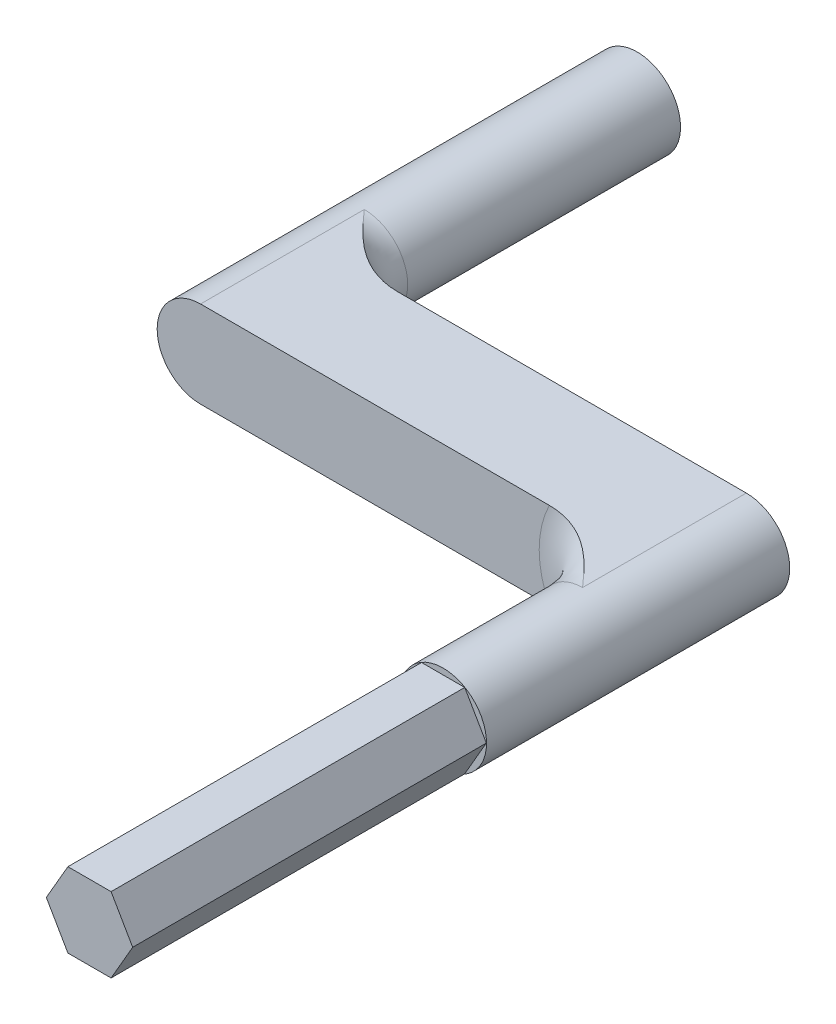
ISO-10303-21;
HEADER;
FILE_DESCRIPTION(('STEP AP214'),'2;1');
FILE_NAME('part.step','',(''),(''),'','','');
FILE_SCHEMA(('AUTOMOTIVE_DESIGN { 1 0 10303 214 1 1 1 1 }'));
ENDSEC;
DATA;
#1=APPLICATION_CONTEXT('core data for automotive mechanical design processes');
#2=APPLICATION_PROTOCOL_DEFINITION('international standard','automotive_design',2000,#1);
#3=PRODUCT_CONTEXT('',#1,'mechanical');
#4=PRODUCT('Part','Part','',(#3));
#5=PRODUCT_RELATED_PRODUCT_CATEGORY('part','',(#4));
#6=PRODUCT_DEFINITION_FORMATION('','',#4);
#7=PRODUCT_DEFINITION_CONTEXT('part definition',#1,'design');
#8=PRODUCT_DEFINITION('design','',#6,#7);
#9=PRODUCT_DEFINITION_SHAPE('','',#8);
#10=(LENGTH_UNIT() NAMED_UNIT(*) SI_UNIT(.MILLI.,.METRE.));
#11=(NAMED_UNIT(*) PLANE_ANGLE_UNIT() SI_UNIT($,.RADIAN.));
#12=(NAMED_UNIT(*) SI_UNIT($,.STERADIAN.) SOLID_ANGLE_UNIT());
#13=UNCERTAINTY_MEASURE_WITH_UNIT(LENGTH_MEASURE(1.E-05),#10,'distance_accuracy_value','');
#14=(GEOMETRIC_REPRESENTATION_CONTEXT(3) GLOBAL_UNCERTAINTY_ASSIGNED_CONTEXT((#13)) GLOBAL_UNIT_ASSIGNED_CONTEXT((#10,
#11,#12)) REPRESENTATION_CONTEXT('',''));
#15=CARTESIAN_POINT('',(0.,0.,0.));
#16=DIRECTION('',(0.,0.,1.));
#17=DIRECTION('',(1.,0.,0.));
#18=AXIS2_PLACEMENT_3D('',#15,#16,#17);
#19=CARTESIAN_POINT('',(0.,0.,17.775));
#20=DIRECTION('',(0.,0.,-1.));
#21=DIRECTION('',(-1.,0.,0.));
#22=AXIS2_PLACEMENT_3D('',#19,#20,#21);
#23=CYLINDRICAL_SURFACE('',#22,3.975);
#24=CARTESIAN_POINT('',(0.,0.,17.775));
#25=DIRECTION('',(0.,0.,1.));
#26=DIRECTION('',(1.,0.,0.));
#27=AXIS2_PLACEMENT_3D('',#24,#25,#26);
#28=CIRCLE('',#27,3.975);
#29=CARTESIAN_POINT('',(3.975,0.,17.775));
#30=VERTEX_POINT('',#29);
#31=EDGE_CURVE('E198',#30,#30,#28,.T.);
#32=ORIENTED_EDGE('',*,*,#31,.F.);
#33=EDGE_LOOP('',(#32));
#34=FACE_BOUND('',#33,.T.);
#35=CARTESIAN_POINT('',(0.,0.,5.));
#36=DIRECTION('',(0.,0.,-1.));
#37=DIRECTION('',(-1.,0.,0.));
#38=AXIS2_PLACEMENT_3D('',#35,#36,#37);
#39=CIRCLE('',#38,3.975);
#40=CARTESIAN_POINT('',(0.,3.975,5.));
#41=VERTEX_POINT('',#40);
#42=CARTESIAN_POINT('',(0.,-3.975,5.));
#43=VERTEX_POINT('',#42);
#44=EDGE_CURVE('E141',#41,#43,#39,.F.);
#45=ORIENTED_EDGE('',*,*,#44,.T.);
#46=DIRECTION('',(0.,0.,1.));
#47=VECTOR('',#46,1.);
#48=CARTESIAN_POINT('',(0.,-3.975,-10.));
#49=LINE('',#48,#47);
#50=CARTESIAN_POINT('',(0.,-3.975,-10.));
#51=VERTEX_POINT('',#50);
#52=EDGE_CURVE('E128',#51,#43,#49,.T.);
#53=ORIENTED_EDGE('',*,*,#52,.F.);
#54=CARTESIAN_POINT('',(0.,0.,-10.));
#55=DIRECTION('',(0.,0.,-1.));
#56=DIRECTION('',(-1.,0.,0.));
#57=AXIS2_PLACEMENT_3D('',#54,#55,#56);
#58=CIRCLE('',#57,3.975);
#59=CARTESIAN_POINT('',(0.,3.975,-10.));
#60=VERTEX_POINT('',#59);
#61=EDGE_CURVE('E131',#60,#51,#58,.T.);
#62=ORIENTED_EDGE('',*,*,#61,.F.);
#63=DIRECTION('',(0.,0.,1.));
#64=VECTOR('',#63,1.);
#65=CARTESIAN_POINT('',(0.,3.975,-10.));
#66=LINE('',#65,#64);
#67=EDGE_CURVE('E242',#60,#41,#66,.T.);
#68=ORIENTED_EDGE('',*,*,#67,.T.);
#69=EDGE_LOOP('',(#45,#53,#62,#68));
#70=FACE_BOUND('',#69,.T.);
#71=ADVANCED_FACE('F33',(#34,#70),#23,.T.);
#72=CARTESIAN_POINT('',(0.,0.,17.775));
#73=DIRECTION('',(0.,0.,1.));
#74=DIRECTION('',(1.,0.,0.));
#75=AXIS2_PLACEMENT_3D('',#72,#73,#74);
#76=PLANE('',#75);
#77=DIRECTION('',(0.5,0.866025403784439,0.));
#78=VECTOR('',#77,1.);
#79=CARTESIAN_POINT('',(1.97834936490539,-3.42660161513776,17.775));
#80=LINE('',#79,#78);
#81=CARTESIAN_POINT('',(1.97834936490539,-3.42660161513776,17.775));
#82=VERTEX_POINT('',#81);
#83=CARTESIAN_POINT('',(3.95669872981078,0.,17.775));
#84=VERTEX_POINT('',#83);
#85=EDGE_CURVE('E142',#82,#84,#80,.T.);
#86=ORIENTED_EDGE('',*,*,#85,.F.);
#87=DIRECTION('',(1.,0.,0.));
#88=VECTOR('',#87,1.);
#89=CARTESIAN_POINT('',(-1.97834936490539,-3.42660161513776,17.775));
#90=LINE('',#89,#88);
#91=CARTESIAN_POINT('',(-1.97834936490539,-3.42660161513776,17.775));
#92=VERTEX_POINT('',#91);
#93=EDGE_CURVE('E157',#92,#82,#90,.T.);
#94=ORIENTED_EDGE('',*,*,#93,.F.);
#95=DIRECTION('',(0.5,-0.866025403784438,0.));
#96=VECTOR('',#95,1.);
#97=CARTESIAN_POINT('',(-3.95669872981078,0.,17.775));
#98=LINE('',#97,#96);
#99=CARTESIAN_POINT('',(-3.95669872981078,0.,17.775));
#100=VERTEX_POINT('',#99);
#101=EDGE_CURVE('E176',#100,#92,#98,.T.);
#102=ORIENTED_EDGE('',*,*,#101,.F.);
#103=DIRECTION('',(-0.5,-0.866025403784439,0.));
#104=VECTOR('',#103,1.);
#105=CARTESIAN_POINT('',(-1.97834936490539,3.42660161513776,17.775));
#106=LINE('',#105,#104);
#107=CARTESIAN_POINT('',(-1.97834936490539,3.42660161513776,17.775));
#108=VERTEX_POINT('',#107);
#109=EDGE_CURVE('E173',#108,#100,#106,.T.);
#110=ORIENTED_EDGE('',*,*,#109,.F.);
#111=DIRECTION('',(-1.,0.,0.));
#112=VECTOR('',#111,1.);
#113=CARTESIAN_POINT('',(1.97834936490539,3.42660161513776,17.775));
#114=LINE('',#113,#112);
#115=CARTESIAN_POINT('',(1.97834936490539,3.42660161513776,17.775));
#116=VERTEX_POINT('',#115);
#117=EDGE_CURVE('E170',#116,#108,#114,.T.);
#118=ORIENTED_EDGE('',*,*,#117,.F.);
#119=DIRECTION('',(-0.5,0.866025403784438,0.));
#120=VECTOR('',#119,1.);
#121=CARTESIAN_POINT('',(3.95669872981078,0.,17.775));
#122=LINE('',#121,#120);
#123=EDGE_CURVE('E146',#84,#116,#122,.T.);
#124=ORIENTED_EDGE('',*,*,#123,.F.);
#125=EDGE_LOOP('',(#86,#94,#102,#110,#118,#124));
#126=FACE_BOUND('',#125,.T.);
#127=ORIENTED_EDGE('',*,*,#31,.T.);
#128=EDGE_LOOP('',(#127));
#129=FACE_BOUND('',#128,.T.);
#130=ADVANCED_FACE('F272',(#126,#129),#76,.T.);
#131=CARTESIAN_POINT('',(1.97834936490539,-3.42660161513776,50.175));
#132=DIRECTION('',(-0.866025403784439,0.5,0.));
#133=DIRECTION('',(-0.5,-0.866025403784439,0.));
#134=AXIS2_PLACEMENT_3D('',#131,#132,#133);
#135=PLANE('',#134);
#136=ORIENTED_EDGE('',*,*,#85,.T.);
#137=DIRECTION('',(0.,0.,-1.));
#138=VECTOR('',#137,1.);
#139=CARTESIAN_POINT('',(3.95669872981078,0.,50.175));
#140=LINE('',#139,#138);
#141=CARTESIAN_POINT('',(3.95669872981078,0.,50.175));
#142=VERTEX_POINT('',#141);
#143=EDGE_CURVE('E195',#142,#84,#140,.T.);
#144=ORIENTED_EDGE('',*,*,#143,.F.);
#145=DIRECTION('',(0.5,0.866025403784439,0.));
#146=VECTOR('',#145,1.);
#147=CARTESIAN_POINT('',(1.97834936490539,-3.42660161513776,50.175));
#148=LINE('',#147,#146);
#149=CARTESIAN_POINT('',(1.97834936490539,-3.42660161513776,50.175));
#150=VERTEX_POINT('',#149);
#151=EDGE_CURVE('E153',#150,#142,#148,.T.);
#152=ORIENTED_EDGE('',*,*,#151,.F.);
#153=DIRECTION('',(0.,0.,-1.));
#154=VECTOR('',#153,1.);
#155=CARTESIAN_POINT('',(1.97834936490539,-3.42660161513776,50.175));
#156=LINE('',#155,#154);
#157=EDGE_CURVE('E166',#150,#82,#156,.T.);
#158=ORIENTED_EDGE('',*,*,#157,.T.);
#159=EDGE_LOOP('',(#136,#144,#152,#158));
#160=FACE_BOUND('',#159,.T.);
#161=ADVANCED_FACE('F277',(#160),#135,.F.);
#162=CARTESIAN_POINT('',(3.95669872981078,0.,50.175));
#163=DIRECTION('',(-0.866025403784439,-0.5,0.));
#164=DIRECTION('',(0.5,-0.866025403784438,0.));
#165=AXIS2_PLACEMENT_3D('',#162,#163,#164);
#166=PLANE('',#165);
#167=ORIENTED_EDGE('',*,*,#123,.T.);
#168=DIRECTION('',(0.,0.,-1.));
#169=VECTOR('',#168,1.);
#170=CARTESIAN_POINT('',(1.97834936490539,3.42660161513776,50.175));
#171=LINE('',#170,#169);
#172=CARTESIAN_POINT('',(1.97834936490539,3.42660161513776,50.175));
#173=VERTEX_POINT('',#172);
#174=EDGE_CURVE('E192',#173,#116,#171,.T.);
#175=ORIENTED_EDGE('',*,*,#174,.F.);
#176=DIRECTION('',(-0.5,0.866025403784438,0.));
#177=VECTOR('',#176,1.);
#178=CARTESIAN_POINT('',(3.95669872981078,0.,50.175));
#179=LINE('',#178,#177);
#180=EDGE_CURVE('E156',#142,#173,#179,.T.);
#181=ORIENTED_EDGE('',*,*,#180,.F.);
#182=ORIENTED_EDGE('',*,*,#143,.T.);
#183=EDGE_LOOP('',(#167,#175,#181,#182));
#184=FACE_BOUND('',#183,.T.);
#185=ADVANCED_FACE('F284',(#184),#166,.F.);
#186=CARTESIAN_POINT('',(1.97834936490539,3.42660161513776,50.175));
#187=DIRECTION('',(0.,-1.,0.));
#188=DIRECTION('',(1.,0.,0.));
#189=AXIS2_PLACEMENT_3D('',#186,#187,#188);
#190=PLANE('',#189);
#191=ORIENTED_EDGE('',*,*,#117,.T.);
#192=DIRECTION('',(0.,0.,-1.));
#193=VECTOR('',#192,1.);
#194=CARTESIAN_POINT('',(-1.97834936490539,3.42660161513776,50.175));
#195=LINE('',#194,#193);
#196=CARTESIAN_POINT('',(-1.97834936490539,3.42660161513776,50.175));
#197=VERTEX_POINT('',#196);
#198=EDGE_CURVE('E189',#197,#108,#195,.T.);
#199=ORIENTED_EDGE('',*,*,#198,.F.);
#200=DIRECTION('',(-1.,0.,0.));
#201=VECTOR('',#200,1.);
#202=CARTESIAN_POINT('',(1.97834936490539,3.42660161513776,50.175));
#203=LINE('',#202,#201);
#204=EDGE_CURVE('E159',#173,#197,#203,.T.);
#205=ORIENTED_EDGE('',*,*,#204,.F.);
#206=ORIENTED_EDGE('',*,*,#174,.T.);
#207=EDGE_LOOP('',(#191,#199,#205,#206));
#208=FACE_BOUND('',#207,.T.);
#209=ADVANCED_FACE('F288',(#208),#190,.F.);
#210=CARTESIAN_POINT('',(-1.97834936490539,3.42660161513776,50.175));
#211=DIRECTION('',(0.866025403784439,-0.5,0.));
#212=DIRECTION('',(0.5,0.866025403784439,0.));
#213=AXIS2_PLACEMENT_3D('',#210,#211,#212);
#214=PLANE('',#213);
#215=ORIENTED_EDGE('',*,*,#109,.T.);
#216=DIRECTION('',(0.,0.,-1.));
#217=VECTOR('',#216,1.);
#218=CARTESIAN_POINT('',(-3.95669872981078,0.,50.175));
#219=LINE('',#218,#217);
#220=CARTESIAN_POINT('',(-3.95669872981078,0.,50.175));
#221=VERTEX_POINT('',#220);
#222=EDGE_CURVE('E186',#221,#100,#219,.T.);
#223=ORIENTED_EDGE('',*,*,#222,.F.);
#224=DIRECTION('',(-0.5,-0.866025403784439,0.));
#225=VECTOR('',#224,1.);
#226=CARTESIAN_POINT('',(-1.97834936490539,3.42660161513776,50.175));
#227=LINE('',#226,#225);
#228=EDGE_CURVE('E161',#197,#221,#227,.T.);
#229=ORIENTED_EDGE('',*,*,#228,.F.);
#230=ORIENTED_EDGE('',*,*,#198,.T.);
#231=EDGE_LOOP('',(#215,#223,#229,#230));
#232=FACE_BOUND('',#231,.T.);
#233=ADVANCED_FACE('F292',(#232),#214,.F.);
#234=CARTESIAN_POINT('',(-3.95669872981078,0.,50.175));
#235=DIRECTION('',(0.866025403784438,0.5,0.));
#236=DIRECTION('',(-0.5,0.866025403784438,0.));
#237=AXIS2_PLACEMENT_3D('',#234,#235,#236);
#238=PLANE('',#237);
#239=ORIENTED_EDGE('',*,*,#101,.T.);
#240=DIRECTION('',(0.,0.,-1.));
#241=VECTOR('',#240,1.);
#242=CARTESIAN_POINT('',(-1.97834936490539,-3.42660161513776,50.175));
#243=LINE('',#242,#241);
#244=CARTESIAN_POINT('',(-1.97834936490539,-3.42660161513776,50.175));
#245=VERTEX_POINT('',#244);
#246=EDGE_CURVE('E183',#245,#92,#243,.T.);
#247=ORIENTED_EDGE('',*,*,#246,.F.);
#248=DIRECTION('',(0.5,-0.866025403784438,0.));
#249=VECTOR('',#248,1.);
#250=CARTESIAN_POINT('',(-3.95669872981078,0.,50.175));
#251=LINE('',#250,#249);
#252=EDGE_CURVE('E163',#221,#245,#251,.T.);
#253=ORIENTED_EDGE('',*,*,#252,.F.);
#254=ORIENTED_EDGE('',*,*,#222,.T.);
#255=EDGE_LOOP('',(#239,#247,#253,#254));
#256=FACE_BOUND('',#255,.T.);
#257=ADVANCED_FACE('F296',(#256),#238,.F.);
#258=CARTESIAN_POINT('',(-1.97834936490539,-3.42660161513776,50.175));
#259=DIRECTION('',(0.,1.,0.));
#260=DIRECTION('',(-1.,0.,0.));
#261=AXIS2_PLACEMENT_3D('',#258,#259,#260);
#262=PLANE('',#261);
#263=ORIENTED_EDGE('',*,*,#93,.T.);
#264=ORIENTED_EDGE('',*,*,#157,.F.);
#265=DIRECTION('',(1.,0.,0.));
#266=VECTOR('',#265,1.);
#267=CARTESIAN_POINT('',(-1.97834936490539,-3.42660161513776,50.175));
#268=LINE('',#267,#266);
#269=EDGE_CURVE('E165',#245,#150,#268,.T.);
#270=ORIENTED_EDGE('',*,*,#269,.F.);
#271=ORIENTED_EDGE('',*,*,#246,.T.);
#272=EDGE_LOOP('',(#263,#264,#270,#271));
#273=FACE_BOUND('',#272,.T.);
#274=ADVANCED_FACE('F299',(#273),#262,.F.);
#275=CARTESIAN_POINT('',(0.,0.,50.175));
#276=DIRECTION('',(0.,0.,1.));
#277=DIRECTION('',(1.,0.,0.));
#278=AXIS2_PLACEMENT_3D('',#275,#276,#277);
#279=PLANE('',#278);
#280=ORIENTED_EDGE('',*,*,#151,.T.);
#281=ORIENTED_EDGE('',*,*,#180,.T.);
#282=ORIENTED_EDGE('',*,*,#204,.T.);
#283=ORIENTED_EDGE('',*,*,#228,.T.);
#284=ORIENTED_EDGE('',*,*,#252,.T.);
#285=ORIENTED_EDGE('',*,*,#269,.T.);
#286=EDGE_LOOP('',(#280,#281,#282,#283,#284,#285));
#287=FACE_BOUND('',#286,.T.);
#288=ADVANCED_FACE('F225',(#287),#279,.T.);
#289=CARTESIAN_POINT('',(0.,-3.975,-10.));
#290=DIRECTION('',(0.,1.,0.));
#291=DIRECTION('',(-1.,0.,0.));
#292=AXIS2_PLACEMENT_3D('',#289,#290,#291);
#293=PLANE('',#292);
#294=ORIENTED_EDGE('',*,*,#52,.T.);
#295=CARTESIAN_POINT('',(-8.04673846971554,-3.975,0.));
#296=CARTESIAN_POINT('',(-7.85487874016233,-3.975,-2.88575140560829E-05));
#297=CARTESIAN_POINT('',(-7.66310165124961,-3.975,0.00887344911979453));
#298=CARTESIAN_POINT('',(-7.28130015016392,-3.975,0.043547133380923));
#299=CARTESIAN_POINT('',(-7.09127389772762,-3.975,0.0692980823962571));
#300=CARTESIAN_POINT('',(-6.7159557693677,-3.975,0.136347231096173));
#301=CARTESIAN_POINT('',(-6.5306356569073,-3.975,0.177489142806721));
#302=CARTESIAN_POINT('',(-6.16376931444971,-3.975,0.274255155935704));
#303=CARTESIAN_POINT('',(-5.98222459218992,-3.975,0.329884927676051));
#304=CARTESIAN_POINT('',(-5.56822196670507,-3.975,0.473774707585373));
#305=CARTESIAN_POINT('',(-5.33741614440136,-3.975,0.566804406717393));
#306=CARTESIAN_POINT('',(-4.88500613504554,-3.975,0.772987982858635));
#307=CARTESIAN_POINT('',(-4.66340421491135,-3.975,0.886146781825669));
#308=CARTESIAN_POINT('',(-4.22927004841288,-3.975,1.13024336774421));
#309=CARTESIAN_POINT('',(-4.01677177379535,-3.975,1.26124121549836));
#310=CARTESIAN_POINT('',(-3.60160908660765,-3.975,1.53804036394351));
#311=CARTESIAN_POINT('',(-3.39894847049448,-3.975,1.68384731354767));
#312=CARTESIAN_POINT('',(-2.90401832246575,-3.975,2.06364680784944));
#313=CARTESIAN_POINT('',(-2.61762243087214,-3.975,2.30527381460516));
#314=CARTESIAN_POINT('',(-2.06252525883527,-3.975,2.80803756914307));
#315=CARTESIAN_POINT('',(-1.79383465511125,-3.975,3.06918588980474));
#316=CARTESIAN_POINT('',(-1.00691770781545,-3.97499999999999,3.87112830180683));
#317=CARTESIAN_POINT('',(-0.507885030320175,-3.97499999999995,4.43038713266551));
#318=CARTESIAN_POINT('',(-0.00627442585328237,-3.975,4.99296294978043));
#319=CARTESIAN_POINT('',(-0.0031372049692922,-3.975,4.99648148197586));
#320=CARTESIAN_POINT('',(0.,-3.975,5.));
#321=B_SPLINE_CURVE_WITH_KNOTS('',3,(#295,#296,#297,#298,#299,#300,#301,#302,#303,#304,#305,
#306,#307,#308,#309,#310,#311,#312,#313,#314,#315,#316,#317,#318,#319,#320),.UNSPECIFIED.,.F.,
.F.,(4,2,2,2,2,2,2,2,2,2,2,2,4),(0.,0.575251058277431,1.14980592647055,1.71867819973788,
2.28777345619586,3.03318404304666,3.77877714851075,4.52694562800108,5.27540057494,
6.39816867436899,7.52160774874456,9.76863732049489,9.78277945611864),.UNSPECIFIED.);
#322=CARTESIAN_POINT('',(-8.04673846971554,-3.975,0.));
#323=VERTEX_POINT('',#322);
#324=EDGE_CURVE('E204',#43,#323,#321,.F.);
#325=ORIENTED_EDGE('',*,*,#324,.T.);
#326=DIRECTION('',(-1.,0.,0.));
#327=VECTOR('',#326,1.);
#328=CARTESIAN_POINT('',(0.,-3.975,0.));
#329=LINE('',#328,#327);
#330=CARTESIAN_POINT('',(-40.,-3.975,0.));
#331=VERTEX_POINT('',#330);
#332=EDGE_CURVE('E248',#323,#331,#329,.T.);
#333=ORIENTED_EDGE('',*,*,#332,.T.);
#334=DIRECTION('',(0.,0.,1.));
#335=VECTOR('',#334,1.);
#336=CARTESIAN_POINT('',(-40.,-3.975,-10.));
#337=LINE('',#336,#335);
#338=CARTESIAN_POINT('',(-40.,-3.975,-15.));
#339=VERTEX_POINT('',#338);
#340=EDGE_CURVE('E143',#339,#331,#337,.T.);
#341=ORIENTED_EDGE('',*,*,#340,.F.);
#342=CARTESIAN_POINT('',(-31.9532615302845,-3.975,-10.));
#343=CARTESIAN_POINT('',(-32.1451212598378,-3.975,-9.99997114248594));
#344=CARTESIAN_POINT('',(-32.3368983487506,-3.975,-10.0088734491198));
#345=CARTESIAN_POINT('',(-32.7186998498364,-3.975,-10.043547133381));
#346=CARTESIAN_POINT('',(-32.9087261022728,-3.975,-10.0692980823963));
#347=CARTESIAN_POINT('',(-33.2840442306327,-3.975,-10.1363472310963));
#348=CARTESIAN_POINT('',(-33.469364343093,-3.975,-10.1774891428068));
#349=CARTESIAN_POINT('',(-33.8362306855505,-3.975,-10.2742551559358));
#350=CARTESIAN_POINT('',(-34.0177754078102,-3.975,-10.3298849276761));
#351=CARTESIAN_POINT('',(-34.4317780332949,-3.975,-10.4737747075853));
#352=CARTESIAN_POINT('',(-34.6625838555985,-3.975,-10.5668044067173));
#353=CARTESIAN_POINT('',(-35.1149938649542,-3.975,-10.7729879828585));
#354=CARTESIAN_POINT('',(-35.3365957850883,-3.975,-10.8861467818255));
#355=CARTESIAN_POINT('',(-35.7707299515868,-3.975,-11.130243367744));
#356=CARTESIAN_POINT('',(-35.9832282262044,-3.975,-11.2612412154982));
#357=CARTESIAN_POINT('',(-36.3983909133922,-3.975,-11.5380403639434));
#358=CARTESIAN_POINT('',(-36.6010515295054,-3.975,-11.6838473135476));
#359=CARTESIAN_POINT('',(-37.0959816775343,-3.975,-12.0636468078494));
#360=CARTESIAN_POINT('',(-37.3823775691281,-3.975,-12.3052738146051));
#361=CARTESIAN_POINT('',(-37.9374747411647,-3.975,-12.8080375691433));
#362=CARTESIAN_POINT('',(-38.2061653448884,-3.975,-13.0691858898054));
#363=CARTESIAN_POINT('',(-38.9930822921858,-3.975,-13.871128301806));
#364=CARTESIAN_POINT('',(-39.4921149696859,-3.975,-14.4303871326603));
#365=CARTESIAN_POINT('',(-39.9937255741468,-3.975,-14.9929629497804));
#366=CARTESIAN_POINT('',(-39.9968627950308,-3.975,-14.9964814819758));
#367=CARTESIAN_POINT('',(-40.,-3.975,-15.));
#368=B_SPLINE_CURVE_WITH_KNOTS('',3,(#342,#343,#344,#345,#346,#347,#348,#349,#350,#351,#352,
#353,#354,#355,#356,#357,#358,#359,#360,#361,#362,#363,#364,#365,#366,#367),.UNSPECIFIED.,.F.,
.F.,(4,2,2,2,2,2,2,2,2,2,2,2,4),(0.,0.575251058277678,1.14980592647107,1.71867819973814,
2.28777345619587,3.03318404304643,3.77877714851033,4.52694562800086,5.27540057494001,
6.39816867436908,7.52160774874493,9.76863732049492,9.78277945611865),.UNSPECIFIED.);
#369=CARTESIAN_POINT('',(-31.9532615302845,-3.975,-10.));
#370=VERTEX_POINT('',#369);
#371=EDGE_CURVE('E47',#339,#370,#368,.F.);
#372=ORIENTED_EDGE('',*,*,#371,.T.);
#373=DIRECTION('',(-1.,0.,0.));
#374=VECTOR('',#373,1.);
#375=CARTESIAN_POINT('',(0.,-3.975,-10.));
#376=LINE('',#375,#374);
#377=EDGE_CURVE('E124',#51,#370,#376,.T.);
#378=ORIENTED_EDGE('',*,*,#377,.F.);
#379=EDGE_LOOP('',(#294,#325,#333,#341,#372,#378));
#380=FACE_BOUND('',#379,.T.);
#381=ADVANCED_FACE('F126',(#380),#293,.F.);
#382=CARTESIAN_POINT('',(-40.,0.,-10.));
#383=DIRECTION('',(0.,0.,1.));
#384=DIRECTION('',(1.,0.,0.));
#385=AXIS2_PLACEMENT_3D('',#382,#383,#384);
#386=CYLINDRICAL_SURFACE('',#385,3.975);
#387=CARTESIAN_POINT('',(-40.,0.,-15.));
#388=DIRECTION('',(0.,0.,-1.));
#389=DIRECTION('',(-1.,0.,0.));
#390=AXIS2_PLACEMENT_3D('',#387,#388,#389);
#391=CIRCLE('',#390,3.975);
#392=CARTESIAN_POINT('',(-40.,3.975,-15.));
#393=VERTEX_POINT('',#392);
#394=EDGE_CURVE('E233',#393,#339,#391,.T.);
#395=ORIENTED_EDGE('',*,*,#394,.T.);
#396=ORIENTED_EDGE('',*,*,#340,.T.);
#397=CARTESIAN_POINT('',(-40.,0.,0.));
#398=DIRECTION('',(0.,0.,-1.));
#399=DIRECTION('',(-1.,0.,0.));
#400=AXIS2_PLACEMENT_3D('',#397,#398,#399);
#401=CIRCLE('',#400,3.975);
#402=CARTESIAN_POINT('',(-40.,3.975,0.));
#403=VERTEX_POINT('',#402);
#404=EDGE_CURVE('E252',#331,#403,#401,.T.);
#405=ORIENTED_EDGE('',*,*,#404,.T.);
#406=DIRECTION('',(0.,0.,1.));
#407=VECTOR('',#406,1.);
#408=CARTESIAN_POINT('',(-40.,3.975,-10.));
#409=LINE('',#408,#407);
#410=EDGE_CURVE('E149',#393,#403,#409,.T.);
#411=ORIENTED_EDGE('',*,*,#410,.F.);
#412=EDGE_LOOP('',(#395,#396,#405,#411));
#413=FACE_BOUND('',#412,.T.);
#414=CARTESIAN_POINT('',(-40.,0.,-40.));
#415=DIRECTION('',(0.,0.,-1.));
#416=DIRECTION('',(-1.,0.,0.));
#417=AXIS2_PLACEMENT_3D('',#414,#415,#416);
#418=CIRCLE('',#417,3.975);
#419=CARTESIAN_POINT('',(-43.975,0.,-40.));
#420=VERTEX_POINT('',#419);
#421=EDGE_CURVE('E253',#420,#420,#418,.T.);
#422=ORIENTED_EDGE('',*,*,#421,.F.);
#423=EDGE_LOOP('',(#422));
#424=FACE_BOUND('',#423,.T.);
#425=ADVANCED_FACE('F224',(#413,#424),#386,.T.);
#426=CARTESIAN_POINT('',(0.,3.975,-10.));
#427=DIRECTION('',(0.,-1.,0.));
#428=DIRECTION('',(1.,0.,0.));
#429=AXIS2_PLACEMENT_3D('',#426,#427,#428);
#430=PLANE('',#429);
#431=DIRECTION('',(1.,0.,0.));
#432=VECTOR('',#431,1.);
#433=CARTESIAN_POINT('',(0.,3.975,0.));
#434=LINE('',#433,#432);
#435=CARTESIAN_POINT('',(-8.04673846971554,3.975,0.));
#436=VERTEX_POINT('',#435);
#437=EDGE_CURVE('E137',#403,#436,#434,.T.);
#438=ORIENTED_EDGE('',*,*,#437,.T.);
#439=CARTESIAN_POINT('',(-8.04673846971554,3.975,0.));
#440=CARTESIAN_POINT('',(-7.85487874016233,3.975,-2.88575140560829E-05));
#441=CARTESIAN_POINT('',(-7.66310165124961,3.975,0.00887344911979453));
#442=CARTESIAN_POINT('',(-7.28130015016392,3.975,0.043547133380923));
#443=CARTESIAN_POINT('',(-7.09127389772762,3.975,0.0692980823962571));
#444=CARTESIAN_POINT('',(-6.7159557693677,3.975,0.136347231096173));
#445=CARTESIAN_POINT('',(-6.5306356569073,3.975,0.177489142806721));
#446=CARTESIAN_POINT('',(-6.16376931444971,3.975,0.274255155935704));
#447=CARTESIAN_POINT('',(-5.98222459218992,3.975,0.329884927676051));
#448=CARTESIAN_POINT('',(-5.56822196670507,3.975,0.473774707585373));
#449=CARTESIAN_POINT('',(-5.33741614440136,3.975,0.566804406717393));
#450=CARTESIAN_POINT('',(-4.88500613504554,3.975,0.772987982858635));
#451=CARTESIAN_POINT('',(-4.66340421491135,3.975,0.886146781825669));
#452=CARTESIAN_POINT('',(-4.22927004841288,3.975,1.13024336774421));
#453=CARTESIAN_POINT('',(-4.01677177379535,3.975,1.26124121549836));
#454=CARTESIAN_POINT('',(-3.60160908660765,3.975,1.53804036394351));
#455=CARTESIAN_POINT('',(-3.39894847049448,3.975,1.68384731354767));
#456=CARTESIAN_POINT('',(-2.90401832246575,3.975,2.06364680784944));
#457=CARTESIAN_POINT('',(-2.61762243087214,3.975,2.30527381460516));
#458=CARTESIAN_POINT('',(-2.06252525883527,3.975,2.80803756914307));
#459=CARTESIAN_POINT('',(-1.79383465511125,3.975,3.06918588980474));
#460=CARTESIAN_POINT('',(-1.00691770781545,3.97499999999999,3.87112830180683));
#461=CARTESIAN_POINT('',(-0.507885030320175,3.97499999999995,4.43038713266551));
#462=CARTESIAN_POINT('',(-0.00627442585328237,3.975,4.99296294978043));
#463=CARTESIAN_POINT('',(-0.0031372049692922,3.975,4.99648148197586));
#464=CARTESIAN_POINT('',(0.,3.975,5.));
#465=B_SPLINE_CURVE_WITH_KNOTS('',3,(#439,#440,#441,#442,#443,#444,#445,#446,#447,#448,#449,
#450,#451,#452,#453,#454,#455,#456,#457,#458,#459,#460,#461,#462,#463,#464),.UNSPECIFIED.,.F.,
.F.,(4,2,2,2,2,2,2,2,2,2,2,2,4),(0.,0.575251058277431,1.14980592647055,1.71867819973788,
2.28777345619586,3.03318404304666,3.77877714851075,4.52694562800108,5.27540057494,
6.39816867436899,7.52160774874456,9.76863732049489,9.78277945611864),.UNSPECIFIED.);
#466=EDGE_CURVE('E211',#436,#41,#465,.T.);
#467=ORIENTED_EDGE('',*,*,#466,.T.);
#468=ORIENTED_EDGE('',*,*,#67,.F.);
#469=DIRECTION('',(1.,0.,0.));
#470=VECTOR('',#469,1.);
#471=CARTESIAN_POINT('',(0.,3.975,-10.));
#472=LINE('',#471,#470);
#473=CARTESIAN_POINT('',(-31.9532615302845,3.975,-10.));
#474=VERTEX_POINT('',#473);
#475=EDGE_CURVE('E130',#474,#60,#472,.T.);
#476=ORIENTED_EDGE('',*,*,#475,.F.);
#477=CARTESIAN_POINT('',(-31.9532615302845,3.975,-10.));
#478=CARTESIAN_POINT('',(-32.1451212598378,3.975,-9.99997114248594));
#479=CARTESIAN_POINT('',(-32.3368983487506,3.975,-10.0088734491198));
#480=CARTESIAN_POINT('',(-32.7186998498364,3.975,-10.043547133381));
#481=CARTESIAN_POINT('',(-32.9087261022728,3.975,-10.0692980823963));
#482=CARTESIAN_POINT('',(-33.2840442306327,3.975,-10.1363472310963));
#483=CARTESIAN_POINT('',(-33.469364343093,3.975,-10.1774891428068));
#484=CARTESIAN_POINT('',(-33.8362306855505,3.975,-10.2742551559358));
#485=CARTESIAN_POINT('',(-34.0177754078102,3.975,-10.3298849276761));
#486=CARTESIAN_POINT('',(-34.4317780332949,3.975,-10.4737747075853));
#487=CARTESIAN_POINT('',(-34.6625838555985,3.975,-10.5668044067173));
#488=CARTESIAN_POINT('',(-35.1149938649542,3.975,-10.7729879828585));
#489=CARTESIAN_POINT('',(-35.3365957850883,3.975,-10.8861467818255));
#490=CARTESIAN_POINT('',(-35.7707299515868,3.975,-11.130243367744));
#491=CARTESIAN_POINT('',(-35.9832282262044,3.975,-11.2612412154982));
#492=CARTESIAN_POINT('',(-36.3983909133922,3.975,-11.5380403639434));
#493=CARTESIAN_POINT('',(-36.6010515295054,3.975,-11.6838473135476));
#494=CARTESIAN_POINT('',(-37.0959816775343,3.975,-12.0636468078494));
#495=CARTESIAN_POINT('',(-37.3823775691281,3.975,-12.3052738146051));
#496=CARTESIAN_POINT('',(-37.9374747411647,3.975,-12.8080375691433));
#497=CARTESIAN_POINT('',(-38.2061653448884,3.975,-13.0691858898054));
#498=CARTESIAN_POINT('',(-38.9930822921858,3.975,-13.871128301806));
#499=CARTESIAN_POINT('',(-39.4921149696859,3.975,-14.4303871326603));
#500=CARTESIAN_POINT('',(-39.9937255741468,3.975,-14.9929629497804));
#501=CARTESIAN_POINT('',(-39.9968627950308,3.975,-14.9964814819758));
#502=CARTESIAN_POINT('',(-40.,3.975,-15.));
#503=B_SPLINE_CURVE_WITH_KNOTS('',3,(#477,#478,#479,#480,#481,#482,#483,#484,#485,#486,#487,
#488,#489,#490,#491,#492,#493,#494,#495,#496,#497,#498,#499,#500,#501,#502),.UNSPECIFIED.,.F.,
.F.,(4,2,2,2,2,2,2,2,2,2,2,2,4),(0.,0.575251058277678,1.14980592647107,1.71867819973814,
2.28777345619587,3.03318404304643,3.77877714851033,4.52694562800086,5.27540057494001,
6.39816867436908,7.52160774874493,9.76863732049492,9.78277945611865),.UNSPECIFIED.);
#504=EDGE_CURVE('E11',#474,#393,#503,.T.);
#505=ORIENTED_EDGE('',*,*,#504,.T.);
#506=ORIENTED_EDGE('',*,*,#410,.T.);
#507=EDGE_LOOP('',(#438,#467,#468,#476,#505,#506));
#508=FACE_BOUND('',#507,.T.);
#509=ADVANCED_FACE('F241',(#508),#430,.F.);
#510=CARTESIAN_POINT('',(0.,0.,-10.));
#511=DIRECTION('',(0.,0.,-1.));
#512=DIRECTION('',(-1.,0.,0.));
#513=AXIS2_PLACEMENT_3D('',#510,#511,#512);
#514=PLANE('',#513);
#515=ORIENTED_EDGE('',*,*,#377,.T.);
#516=CARTESIAN_POINT('',(-40.,0.,-10.));
#517=DIRECTION('',(0.,0.,-1.));
#518=DIRECTION('',(-1.,0.,0.));
#519=AXIS2_PLACEMENT_3D('',#516,#517,#518);
#520=CIRCLE('',#519,8.975);
#521=EDGE_CURVE('E60',#370,#474,#520,.F.);
#522=ORIENTED_EDGE('',*,*,#521,.T.);
#523=ORIENTED_EDGE('',*,*,#475,.T.);
#524=ORIENTED_EDGE('',*,*,#61,.T.);
#525=EDGE_LOOP('',(#515,#522,#523,#524));
#526=FACE_BOUND('',#525,.T.);
#527=ADVANCED_FACE('F134',(#526),#514,.T.);
#528=CARTESIAN_POINT('',(0.,0.,0.));
#529=DIRECTION('',(0.,0.,-1.));
#530=DIRECTION('',(-1.,0.,0.));
#531=AXIS2_PLACEMENT_3D('',#528,#529,#530);
#532=PLANE('',#531);
#533=ORIENTED_EDGE('',*,*,#332,.F.);
#534=CARTESIAN_POINT('',(0.,0.,0.));
#535=DIRECTION('',(0.,0.,-1.));
#536=DIRECTION('',(-1.,0.,0.));
#537=AXIS2_PLACEMENT_3D('',#534,#535,#536);
#538=CIRCLE('',#537,8.975);
#539=EDGE_CURVE('E202',#323,#436,#538,.T.);
#540=ORIENTED_EDGE('',*,*,#539,.T.);
#541=ORIENTED_EDGE('',*,*,#437,.F.);
#542=ORIENTED_EDGE('',*,*,#404,.F.);
#543=EDGE_LOOP('',(#533,#540,#541,#542));
#544=FACE_BOUND('',#543,.T.);
#545=ADVANCED_FACE('F251',(#544),#532,.F.);
#546=CARTESIAN_POINT('',(0.,0.,5.));
#547=DIRECTION('',(0.,0.,-1.));
#548=DIRECTION('',(-1.,0.,0.));
#549=AXIS2_PLACEMENT_3D('',#546,#547,#548);
#550=TOROIDAL_SURFACE('',#549,8.975,5.);
#551=ORIENTED_EDGE('',*,*,#466,.F.);
#552=ORIENTED_EDGE('',*,*,#539,.F.);
#553=ORIENTED_EDGE('',*,*,#324,.F.);
#554=ORIENTED_EDGE('',*,*,#44,.F.);
#555=EDGE_LOOP('',(#551,#552,#553,#554));
#556=FACE_BOUND('',#555,.T.);
#557=ADVANCED_FACE('F217',(#556),#550,.F.);
#558=CARTESIAN_POINT('',(-40.,0.,-40.));
#559=DIRECTION('',(0.,0.,-1.));
#560=DIRECTION('',(-1.,0.,0.));
#561=AXIS2_PLACEMENT_3D('',#558,#559,#560);
#562=PLANE('',#561);
#563=ORIENTED_EDGE('',*,*,#421,.T.);
#564=EDGE_LOOP('',(#563));
#565=FACE_BOUND('',#564,.T.);
#566=ADVANCED_FACE('F265',(#565),#562,.T.);
#567=CARTESIAN_POINT('',(-40.,0.,-15.));
#568=DIRECTION('',(0.,0.,-1.));
#569=DIRECTION('',(-1.,0.,0.));
#570=AXIS2_PLACEMENT_3D('',#567,#568,#569);
#571=TOROIDAL_SURFACE('',#570,8.975,5.);
#572=ORIENTED_EDGE('',*,*,#504,.F.);
#573=ORIENTED_EDGE('',*,*,#521,.F.);
#574=ORIENTED_EDGE('',*,*,#371,.F.);
#575=ORIENTED_EDGE('',*,*,#394,.F.);
#576=EDGE_LOOP('',(#572,#573,#574,#575));
#577=FACE_BOUND('',#576,.T.);
#578=ADVANCED_FACE('F35',(#577),#571,.F.);
#579=CLOSED_SHELL('',(#71,#130,#161,#185,#209,#233,#257,#274,#288,#381,#425,#509,#527,#545,#557,
#566,#578));
#580=MANIFOLD_SOLID_BREP('B2',#579);
#581=ADVANCED_BREP_SHAPE_REPRESENTATION('',(#18,#580),#14);
#582=SHAPE_DEFINITION_REPRESENTATION(#9,#581);
ENDSEC;
END-ISO-10303-21;
